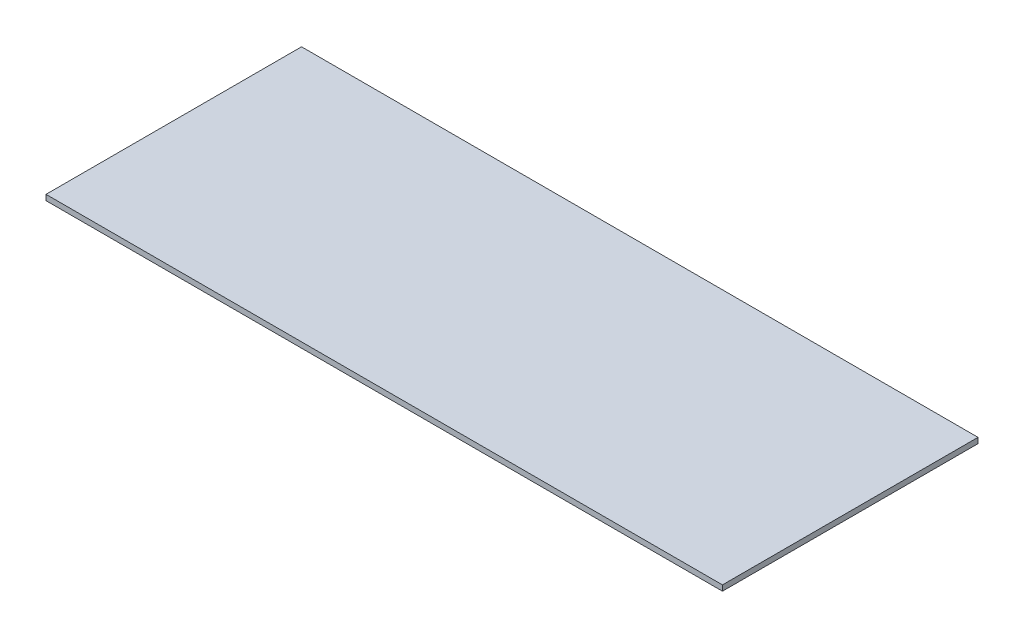
ISO-10303-21;
HEADER;
FILE_DESCRIPTION(('STEP AP214'),'2;1');
FILE_NAME('part.step','',(''),(''),'','','');
FILE_SCHEMA(('AUTOMOTIVE_DESIGN { 1 0 10303 214 1 1 1 1 }'));
ENDSEC;
DATA;
#1=APPLICATION_CONTEXT('core data for automotive mechanical design processes');
#2=APPLICATION_PROTOCOL_DEFINITION('international standard','automotive_design',2000,#1);
#3=PRODUCT_CONTEXT('',#1,'mechanical');
#4=PRODUCT('Part','Part','',(#3));
#5=PRODUCT_RELATED_PRODUCT_CATEGORY('part','',(#4));
#6=PRODUCT_DEFINITION_FORMATION('','',#4);
#7=PRODUCT_DEFINITION_CONTEXT('part definition',#1,'design');
#8=PRODUCT_DEFINITION('design','',#6,#7);
#9=PRODUCT_DEFINITION_SHAPE('','',#8);
#10=(LENGTH_UNIT() NAMED_UNIT(*) SI_UNIT(.MILLI.,.METRE.));
#11=(NAMED_UNIT(*) PLANE_ANGLE_UNIT() SI_UNIT($,.RADIAN.));
#12=(NAMED_UNIT(*) SI_UNIT($,.STERADIAN.) SOLID_ANGLE_UNIT());
#13=UNCERTAINTY_MEASURE_WITH_UNIT(LENGTH_MEASURE(1.E-05),#10,'distance_accuracy_value','');
#14=(GEOMETRIC_REPRESENTATION_CONTEXT(3) GLOBAL_UNCERTAINTY_ASSIGNED_CONTEXT((#13)) GLOBAL_UNIT_ASSIGNED_CONTEXT((#10,
#11,#12)) REPRESENTATION_CONTEXT('',''));
#15=CARTESIAN_POINT('',(0.,0.,0.));
#16=DIRECTION('',(0.,0.,1.));
#17=DIRECTION('',(1.,0.,0.));
#18=AXIS2_PLACEMENT_3D('',#15,#16,#17);
#19=CARTESIAN_POINT('',(0.,1.016,0.));
#20=DIRECTION('',(-1.,0.,0.));
#21=DIRECTION('',(0.,0.,1.));
#22=AXIS2_PLACEMENT_3D('',#19,#20,#21);
#23=PLANE('',#22);
#24=DIRECTION('',(0.,0.,1.));
#25=VECTOR('',#24,1.);
#26=CARTESIAN_POINT('',(0.,0.,0.));
#27=LINE('',#26,#25);
#28=CARTESIAN_POINT('',(0.,0.,-47.2235765558832));
#29=VERTEX_POINT('',#28);
#30=CARTESIAN_POINT('',(0.,0.,0.));
#31=VERTEX_POINT('',#30);
#32=EDGE_CURVE('E103',#29,#31,#27,.T.);
#33=ORIENTED_EDGE('',*,*,#32,.T.);
#34=DIRECTION('',(0.,-1.,0.));
#35=VECTOR('',#34,1.);
#36=CARTESIAN_POINT('',(0.,1.016,0.));
#37=LINE('',#36,#35);
#38=CARTESIAN_POINT('',(0.,1.016,0.));
#39=VERTEX_POINT('',#38);
#40=EDGE_CURVE('E42',#39,#31,#37,.T.);
#41=ORIENTED_EDGE('',*,*,#40,.F.);
#42=DIRECTION('',(0.,0.,1.));
#43=VECTOR('',#42,1.);
#44=CARTESIAN_POINT('',(0.,1.016,0.));
#45=LINE('',#44,#43);
#46=CARTESIAN_POINT('',(0.,1.016,-47.2235765558832));
#47=VERTEX_POINT('',#46);
#48=EDGE_CURVE('E92',#47,#39,#45,.T.);
#49=ORIENTED_EDGE('',*,*,#48,.F.);
#50=DIRECTION('',(0.,-1.,0.));
#51=VECTOR('',#50,1.);
#52=CARTESIAN_POINT('',(0.,1.016,-47.2235765558832));
#53=LINE('',#52,#51);
#54=EDGE_CURVE('E11',#47,#29,#53,.T.);
#55=ORIENTED_EDGE('',*,*,#54,.T.);
#56=EDGE_LOOP('',(#33,#41,#49,#55));
#57=FACE_BOUND('',#56,.T.);
#58=ADVANCED_FACE('F39',(#57),#23,.T.);
#59=CARTESIAN_POINT('',(0.,1.016,-47.2235765558832));
#60=DIRECTION('',(0.,0.,-1.));
#61=DIRECTION('',(-1.,0.,0.));
#62=AXIS2_PLACEMENT_3D('',#59,#60,#61);
#63=PLANE('',#62);
#64=DIRECTION('',(-1.,0.,0.));
#65=VECTOR('',#64,1.);
#66=CARTESIAN_POINT('',(0.,0.,-47.2235765558832));
#67=LINE('',#66,#65);
#68=CARTESIAN_POINT('',(125.,0.,-47.2235765558832));
#69=VERTEX_POINT('',#68);
#70=EDGE_CURVE('E80',#69,#29,#67,.T.);
#71=ORIENTED_EDGE('',*,*,#70,.T.);
#72=ORIENTED_EDGE('',*,*,#54,.F.);
#73=DIRECTION('',(-1.,0.,0.));
#74=VECTOR('',#73,1.);
#75=CARTESIAN_POINT('',(0.,1.016,-47.2235765558832));
#76=LINE('',#75,#74);
#77=CARTESIAN_POINT('',(125.,1.016,-47.2235765558832));
#78=VERTEX_POINT('',#77);
#79=EDGE_CURVE('E57',#78,#47,#76,.T.);
#80=ORIENTED_EDGE('',*,*,#79,.F.);
#81=DIRECTION('',(0.,-1.,0.));
#82=VECTOR('',#81,1.);
#83=CARTESIAN_POINT('',(125.,1.016,-47.2235765558832));
#84=LINE('',#83,#82);
#85=EDGE_CURVE('E48',#78,#69,#84,.T.);
#86=ORIENTED_EDGE('',*,*,#85,.T.);
#87=EDGE_LOOP('',(#71,#72,#80,#86));
#88=FACE_BOUND('',#87,.T.);
#89=ADVANCED_FACE('F109',(#88),#63,.T.);
#90=CARTESIAN_POINT('',(125.,1.016,0.));
#91=DIRECTION('',(1.,0.,0.));
#92=DIRECTION('',(0.,0.,-1.));
#93=AXIS2_PLACEMENT_3D('',#90,#91,#92);
#94=PLANE('',#93);
#95=DIRECTION('',(0.,0.,-1.));
#96=VECTOR('',#95,1.);
#97=CARTESIAN_POINT('',(125.,0.,0.));
#98=LINE('',#97,#96);
#99=CARTESIAN_POINT('',(125.,0.,0.));
#100=VERTEX_POINT('',#99);
#101=EDGE_CURVE('E74',#100,#69,#98,.T.);
#102=ORIENTED_EDGE('',*,*,#101,.T.);
#103=ORIENTED_EDGE('',*,*,#85,.F.);
#104=DIRECTION('',(0.,0.,-1.));
#105=VECTOR('',#104,1.);
#106=CARTESIAN_POINT('',(125.,1.016,0.));
#107=LINE('',#106,#105);
#108=CARTESIAN_POINT('',(125.,1.016,0.));
#109=VERTEX_POINT('',#108);
#110=EDGE_CURVE('E90',#109,#78,#107,.T.);
#111=ORIENTED_EDGE('',*,*,#110,.F.);
#112=DIRECTION('',(0.,-1.,0.));
#113=VECTOR('',#112,1.);
#114=CARTESIAN_POINT('',(125.,1.016,0.));
#115=LINE('',#114,#113);
#116=EDGE_CURVE('E95',#109,#100,#115,.T.);
#117=ORIENTED_EDGE('',*,*,#116,.T.);
#118=EDGE_LOOP('',(#102,#103,#111,#117));
#119=FACE_BOUND('',#118,.T.);
#120=ADVANCED_FACE('F98',(#119),#94,.T.);
#121=CARTESIAN_POINT('',(0.,1.016,0.));
#122=DIRECTION('',(0.,0.,1.));
#123=DIRECTION('',(1.,0.,0.));
#124=AXIS2_PLACEMENT_3D('',#121,#122,#123);
#125=PLANE('',#124);
#126=DIRECTION('',(1.,0.,0.));
#127=VECTOR('',#126,1.);
#128=CARTESIAN_POINT('',(0.,0.,0.));
#129=LINE('',#128,#127);
#130=EDGE_CURVE('E97',#31,#100,#129,.T.);
#131=ORIENTED_EDGE('',*,*,#130,.T.);
#132=ORIENTED_EDGE('',*,*,#116,.F.);
#133=DIRECTION('',(1.,0.,0.));
#134=VECTOR('',#133,1.);
#135=CARTESIAN_POINT('',(0.,1.016,0.));
#136=LINE('',#135,#134);
#137=EDGE_CURVE('E87',#39,#109,#136,.T.);
#138=ORIENTED_EDGE('',*,*,#137,.F.);
#139=ORIENTED_EDGE('',*,*,#40,.T.);
#140=EDGE_LOOP('',(#131,#132,#138,#139));
#141=FACE_BOUND('',#140,.T.);
#142=ADVANCED_FACE('F96',(#141),#125,.T.);
#143=CARTESIAN_POINT('',(0.,1.016,0.));
#144=DIRECTION('',(0.,1.,0.));
#145=DIRECTION('',(0.,0.,-1.));
#146=AXIS2_PLACEMENT_3D('',#143,#144,#145);
#147=PLANE('',#146);
#148=ORIENTED_EDGE('',*,*,#48,.T.);
#149=ORIENTED_EDGE('',*,*,#137,.T.);
#150=ORIENTED_EDGE('',*,*,#110,.T.);
#151=ORIENTED_EDGE('',*,*,#79,.T.);
#152=EDGE_LOOP('',(#148,#149,#150,#151));
#153=FACE_BOUND('',#152,.T.);
#154=ADVANCED_FACE('F88',(#153),#147,.T.);
#155=CARTESIAN_POINT('',(0.,0.,0.));
#156=DIRECTION('',(0.,1.,0.));
#157=DIRECTION('',(0.,0.,-1.));
#158=AXIS2_PLACEMENT_3D('',#155,#156,#157);
#159=PLANE('',#158);
#160=ORIENTED_EDGE('',*,*,#32,.F.);
#161=ORIENTED_EDGE('',*,*,#70,.F.);
#162=ORIENTED_EDGE('',*,*,#101,.F.);
#163=ORIENTED_EDGE('',*,*,#130,.F.);
#164=EDGE_LOOP('',(#160,#161,#162,#163));
#165=FACE_BOUND('',#164,.T.);
#166=ADVANCED_FACE('F112',(#165),#159,.F.);
#167=CLOSED_SHELL('',(#58,#89,#120,#142,#154,#166));
#168=MANIFOLD_SOLID_BREP('B2',#167);
#169=ADVANCED_BREP_SHAPE_REPRESENTATION('',(#18,#168),#14);
#170=SHAPE_DEFINITION_REPRESENTATION(#9,#169);
ENDSEC;
END-ISO-10303-21;
